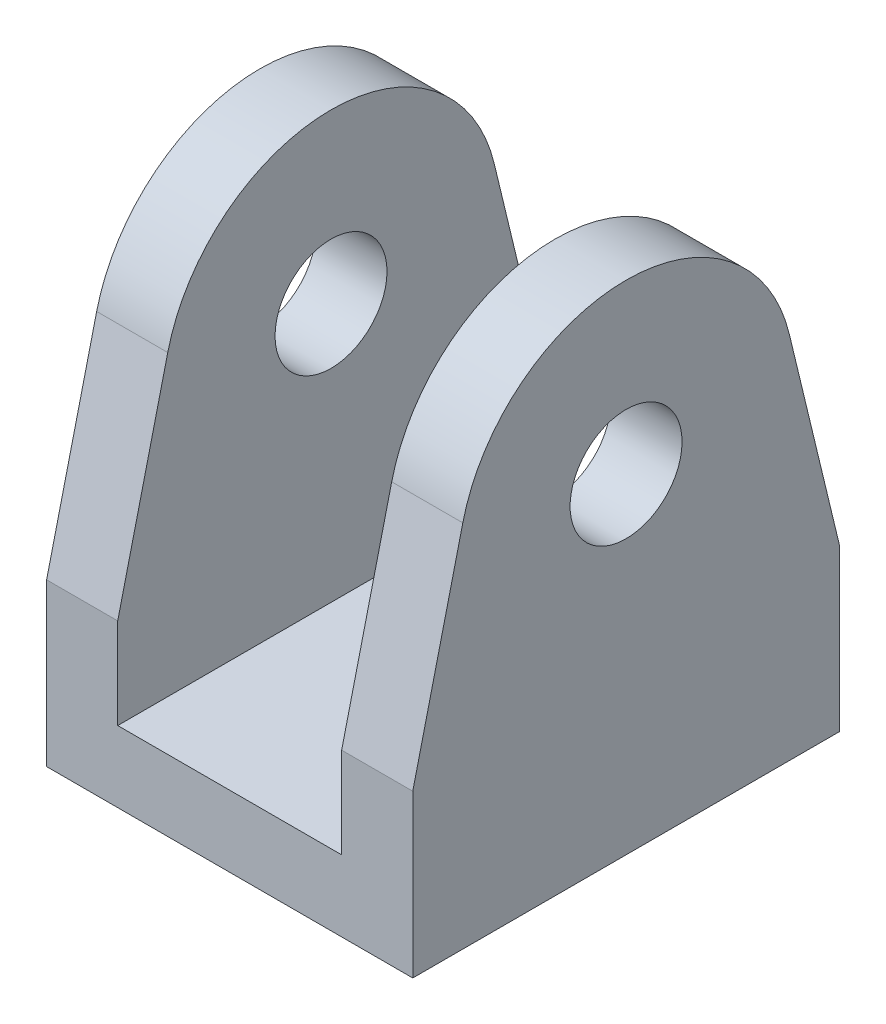
ISO-10303-21;
HEADER;
FILE_DESCRIPTION(('STEP AP214'),'2;1');
FILE_NAME('part.step','',(''),(''),'','','');
FILE_SCHEMA(('AUTOMOTIVE_DESIGN { 1 0 10303 214 1 1 1 1 }'));
ENDSEC;
DATA;
#1=APPLICATION_CONTEXT('core data for automotive mechanical design processes');
#2=APPLICATION_PROTOCOL_DEFINITION('international standard','automotive_design',2000,#1);
#3=PRODUCT_CONTEXT('',#1,'mechanical');
#4=PRODUCT('Part','Part','',(#3));
#5=PRODUCT_RELATED_PRODUCT_CATEGORY('part','',(#4));
#6=PRODUCT_DEFINITION_FORMATION('','',#4);
#7=PRODUCT_DEFINITION_CONTEXT('part definition',#1,'design');
#8=PRODUCT_DEFINITION('design','',#6,#7);
#9=PRODUCT_DEFINITION_SHAPE('','',#8);
#10=(LENGTH_UNIT() NAMED_UNIT(*) SI_UNIT(.MILLI.,.METRE.));
#11=(NAMED_UNIT(*) PLANE_ANGLE_UNIT() SI_UNIT($,.RADIAN.));
#12=(NAMED_UNIT(*) SI_UNIT($,.STERADIAN.) SOLID_ANGLE_UNIT());
#13=UNCERTAINTY_MEASURE_WITH_UNIT(LENGTH_MEASURE(1.E-05),#10,'distance_accuracy_value','');
#14=(GEOMETRIC_REPRESENTATION_CONTEXT(3) GLOBAL_UNCERTAINTY_ASSIGNED_CONTEXT((#13)) GLOBAL_UNIT_ASSIGNED_CONTEXT((#10,
#11,#12)) REPRESENTATION_CONTEXT('',''));
#15=CARTESIAN_POINT('',(0.,0.,0.));
#16=DIRECTION('',(0.,0.,1.));
#17=DIRECTION('',(1.,0.,0.));
#18=AXIS2_PLACEMENT_3D('',#15,#16,#17);
#19=CARTESIAN_POINT('',(-8.175,3.175,0.));
#20=DIRECTION('',(-1.,0.,0.));
#21=DIRECTION('',(0.,0.,1.));
#22=AXIS2_PLACEMENT_3D('',#19,#20,#21);
#23=PLANE('',#22);
#24=CARTESIAN_POINT('',(-8.175,14.725,0.));
#25=DIRECTION('',(1.,0.,0.));
#26=DIRECTION('',(0.,0.,-1.));
#27=AXIS2_PLACEMENT_3D('',#24,#25,#26);
#28=CIRCLE('',#27,2.5);
#29=CARTESIAN_POINT('',(-8.175,14.725,-2.5));
#30=VERTEX_POINT('',#29);
#31=EDGE_CURVE('E367',#30,#30,#28,.T.);
#32=ORIENTED_EDGE('',*,*,#31,.T.);
#33=EDGE_LOOP('',(#32));
#34=FACE_BOUND('',#33,.T.);
#35=CARTESIAN_POINT('',(-8.175,14.725,0.));
#36=DIRECTION('',(1.,0.,0.));
#37=DIRECTION('',(0.,0.,-1.));
#38=AXIS2_PLACEMENT_3D('',#35,#36,#37);
#39=CIRCLE('',#38,7.5);
#40=CARTESIAN_POINT('',(-8.175,16.4842521719163,-7.29074974166635));
#41=VERTEX_POINT('',#40);
#42=CARTESIAN_POINT('',(-8.175,16.4842521719163,7.29074974166635));
#43=VERTEX_POINT('',#42);
#44=EDGE_CURVE('E128',#41,#43,#39,.T.);
#45=ORIENTED_EDGE('',*,*,#44,.F.);
#46=DIRECTION('',(0.,0.972099965555513,0.234566956255502));
#47=VECTOR('',#46,1.);
#48=CARTESIAN_POINT('',(-8.175,2.5694460707549,-10.6483814973363));
#49=LINE('',#48,#47);
#50=CARTESIAN_POINT('',(-8.175,7.22499999999999,-9.525));
#51=VERTEX_POINT('',#50);
#52=EDGE_CURVE('E130',#51,#41,#49,.T.);
#53=ORIENTED_EDGE('',*,*,#52,.F.);
#54=DIRECTION('',(0.,-1.,0.));
#55=VECTOR('',#54,1.);
#56=CARTESIAN_POINT('',(-8.175,3.175,-9.525));
#57=LINE('',#56,#55);
#58=CARTESIAN_POINT('',(-8.175,0.,-9.525));
#59=VERTEX_POINT('',#58);
#60=EDGE_CURVE('E214',#51,#59,#57,.T.);
#61=ORIENTED_EDGE('',*,*,#60,.T.);
#62=DIRECTION('',(0.,0.,-1.));
#63=VECTOR('',#62,1.);
#64=CARTESIAN_POINT('',(-8.175,0.,0.));
#65=LINE('',#64,#63);
#66=CARTESIAN_POINT('',(-8.175,0.,9.525));
#67=VERTEX_POINT('',#66);
#68=EDGE_CURVE('E202',#67,#59,#65,.T.);
#69=ORIENTED_EDGE('',*,*,#68,.F.);
#70=DIRECTION('',(0.,-1.,0.));
#71=VECTOR('',#70,1.);
#72=CARTESIAN_POINT('',(-8.175,3.175,9.525));
#73=LINE('',#72,#71);
#74=CARTESIAN_POINT('',(-8.175,7.22499999999999,9.525));
#75=VERTEX_POINT('',#74);
#76=EDGE_CURVE('E212',#75,#67,#73,.T.);
#77=ORIENTED_EDGE('',*,*,#76,.F.);
#78=DIRECTION('',(0.,0.972099965555513,-0.234566956255502));
#79=VECTOR('',#78,1.);
#80=CARTESIAN_POINT('',(-8.175,2.5694460707549,10.6483814973363));
#81=LINE('',#80,#79);
#82=EDGE_CURVE('E133',#75,#43,#81,.T.);
#83=ORIENTED_EDGE('',*,*,#82,.T.);
#84=EDGE_LOOP('',(#45,#53,#61,#69,#77,#83));
#85=FACE_BOUND('',#84,.T.);
#86=ADVANCED_FACE('F36',(#34,#85),#23,.T.);
#87=CARTESIAN_POINT('',(8.175,3.175,0.));
#88=DIRECTION('',(-1.,0.,0.));
#89=DIRECTION('',(0.,0.,1.));
#90=AXIS2_PLACEMENT_3D('',#87,#88,#89);
#91=PLANE('',#90);
#92=CARTESIAN_POINT('',(8.175,14.725,0.));
#93=DIRECTION('',(1.,0.,0.));
#94=DIRECTION('',(0.,0.,-1.));
#95=AXIS2_PLACEMENT_3D('',#92,#93,#94);
#96=CIRCLE('',#95,2.5);
#97=CARTESIAN_POINT('',(8.175,14.725,-2.5));
#98=VERTEX_POINT('',#97);
#99=EDGE_CURVE('E377',#98,#98,#96,.T.);
#100=ORIENTED_EDGE('',*,*,#99,.F.);
#101=EDGE_LOOP('',(#100));
#102=FACE_BOUND('',#101,.T.);
#103=DIRECTION('',(0.,0.972099965555513,0.234566956255502));
#104=VECTOR('',#103,1.);
#105=CARTESIAN_POINT('',(8.175,2.5694460707549,-10.6483814973363));
#106=LINE('',#105,#104);
#107=CARTESIAN_POINT('',(8.175,7.22499999999999,-9.525));
#108=VERTEX_POINT('',#107);
#109=CARTESIAN_POINT('',(8.175,16.4842521719163,-7.29074974166635));
#110=VERTEX_POINT('',#109);
#111=EDGE_CURVE('E148',#108,#110,#106,.T.);
#112=ORIENTED_EDGE('',*,*,#111,.T.);
#113=CARTESIAN_POINT('',(8.175,14.725,0.));
#114=DIRECTION('',(1.,0.,0.));
#115=DIRECTION('',(0.,0.,-1.));
#116=AXIS2_PLACEMENT_3D('',#113,#114,#115);
#117=CIRCLE('',#116,7.5);
#118=CARTESIAN_POINT('',(8.175,16.4842521719163,7.29074974166635));
#119=VERTEX_POINT('',#118);
#120=EDGE_CURVE('E162',#110,#119,#117,.T.);
#121=ORIENTED_EDGE('',*,*,#120,.T.);
#122=DIRECTION('',(0.,0.972099965555513,-0.234566956255502));
#123=VECTOR('',#122,1.);
#124=CARTESIAN_POINT('',(8.175,2.5694460707549,10.6483814973363));
#125=LINE('',#124,#123);
#126=CARTESIAN_POINT('',(8.175,7.22499999999999,9.525));
#127=VERTEX_POINT('',#126);
#128=EDGE_CURVE('E138',#127,#119,#125,.T.);
#129=ORIENTED_EDGE('',*,*,#128,.F.);
#130=DIRECTION('',(0.,-1.,0.));
#131=VECTOR('',#130,1.);
#132=CARTESIAN_POINT('',(8.175,3.175,9.525));
#133=LINE('',#132,#131);
#134=CARTESIAN_POINT('',(8.175,0.,9.525));
#135=VERTEX_POINT('',#134);
#136=EDGE_CURVE('E210',#127,#135,#133,.T.);
#137=ORIENTED_EDGE('',*,*,#136,.T.);
#138=DIRECTION('',(0.,0.,-1.));
#139=VECTOR('',#138,1.);
#140=CARTESIAN_POINT('',(8.175,0.,0.));
#141=LINE('',#140,#139);
#142=CARTESIAN_POINT('',(8.175,0.,-9.525));
#143=VERTEX_POINT('',#142);
#144=EDGE_CURVE('E197',#135,#143,#141,.T.);
#145=ORIENTED_EDGE('',*,*,#144,.T.);
#146=DIRECTION('',(0.,-1.,0.));
#147=VECTOR('',#146,1.);
#148=CARTESIAN_POINT('',(8.175,3.175,-9.525));
#149=LINE('',#148,#147);
#150=EDGE_CURVE('E58',#108,#143,#149,.T.);
#151=ORIENTED_EDGE('',*,*,#150,.F.);
#152=EDGE_LOOP('',(#112,#121,#129,#137,#145,#151));
#153=FACE_BOUND('',#152,.T.);
#154=ADVANCED_FACE('F242',(#102,#153),#91,.F.);
#155=CARTESIAN_POINT('',(-5.,22.225,0.));
#156=DIRECTION('',(-1.,0.,0.));
#157=DIRECTION('',(0.,0.,1.));
#158=AXIS2_PLACEMENT_3D('',#155,#156,#157);
#159=PLANE('',#158);
#160=CARTESIAN_POINT('',(-5.,14.725,0.));
#161=DIRECTION('',(-1.,0.,0.));
#162=DIRECTION('',(0.,0.,1.));
#163=AXIS2_PLACEMENT_3D('',#160,#161,#162);
#164=CIRCLE('',#163,2.5);
#165=CARTESIAN_POINT('',(-5.,14.725,2.5));
#166=VERTEX_POINT('',#165);
#167=EDGE_CURVE('E370',#166,#166,#164,.T.);
#168=ORIENTED_EDGE('',*,*,#167,.T.);
#169=EDGE_LOOP('',(#168));
#170=FACE_BOUND('',#169,.T.);
#171=DIRECTION('',(0.,-0.972099965555513,-0.234566956255502));
#172=VECTOR('',#171,1.);
#173=CARTESIAN_POINT('',(-5.,23.571589744664,-5.58058076594309));
#174=LINE('',#173,#172);
#175=CARTESIAN_POINT('',(-5.,16.4842521719163,-7.29074974166635));
#176=VERTEX_POINT('',#175);
#177=CARTESIAN_POINT('',(-5.,7.22499999999999,-9.525));
#178=VERTEX_POINT('',#177);
#179=EDGE_CURVE('E161',#176,#178,#174,.T.);
#180=ORIENTED_EDGE('',*,*,#179,.F.);
#181=CARTESIAN_POINT('',(-5.,14.725,0.));
#182=DIRECTION('',(-1.,0.,0.));
#183=DIRECTION('',(0.,0.,1.));
#184=AXIS2_PLACEMENT_3D('',#181,#182,#183);
#185=CIRCLE('',#184,7.5);
#186=CARTESIAN_POINT('',(-5.,16.4842521719163,7.29074974166635));
#187=VERTEX_POINT('',#186);
#188=EDGE_CURVE('E152',#187,#176,#185,.T.);
#189=ORIENTED_EDGE('',*,*,#188,.F.);
#190=DIRECTION('',(0.,-0.972099965555513,0.234566956255502));
#191=VECTOR('',#190,1.);
#192=CARTESIAN_POINT('',(-5.,23.571589744664,5.58058076594309));
#193=LINE('',#192,#191);
#194=CARTESIAN_POINT('',(-5.,7.22499999999999,9.525));
#195=VERTEX_POINT('',#194);
#196=EDGE_CURVE('E178',#187,#195,#193,.T.);
#197=ORIENTED_EDGE('',*,*,#196,.T.);
#198=DIRECTION('',(0.,-1.,0.));
#199=VECTOR('',#198,1.);
#200=CARTESIAN_POINT('',(-5.,22.225,9.525));
#201=LINE('',#200,#199);
#202=CARTESIAN_POINT('',(-5.,3.175,9.525));
#203=VERTEX_POINT('',#202);
#204=EDGE_CURVE('E51',#195,#203,#201,.T.);
#205=ORIENTED_EDGE('',*,*,#204,.T.);
#206=DIRECTION('',(0.,0.,-1.));
#207=VECTOR('',#206,1.);
#208=CARTESIAN_POINT('',(-5.,3.175,0.));
#209=LINE('',#208,#207);
#210=CARTESIAN_POINT('',(-5.,3.175,-9.525));
#211=VERTEX_POINT('',#210);
#212=EDGE_CURVE('E186',#203,#211,#209,.T.);
#213=ORIENTED_EDGE('',*,*,#212,.T.);
#214=DIRECTION('',(0.,-1.,0.));
#215=VECTOR('',#214,1.);
#216=CARTESIAN_POINT('',(-5.,22.225,-9.525));
#217=LINE('',#216,#215);
#218=EDGE_CURVE('E189',#178,#211,#217,.T.);
#219=ORIENTED_EDGE('',*,*,#218,.F.);
#220=EDGE_LOOP('',(#180,#189,#197,#205,#213,#219));
#221=FACE_BOUND('',#220,.T.);
#222=ADVANCED_FACE('F250',(#170,#221),#159,.F.);
#223=CARTESIAN_POINT('',(5.,22.225,0.));
#224=DIRECTION('',(-1.,0.,0.));
#225=DIRECTION('',(0.,0.,1.));
#226=AXIS2_PLACEMENT_3D('',#223,#224,#225);
#227=PLANE('',#226);
#228=CARTESIAN_POINT('',(5.,14.725,0.));
#229=DIRECTION('',(-1.,0.,0.));
#230=DIRECTION('',(0.,0.,1.));
#231=AXIS2_PLACEMENT_3D('',#228,#229,#230);
#232=CIRCLE('',#231,2.5);
#233=CARTESIAN_POINT('',(5.,14.725,2.5));
#234=VERTEX_POINT('',#233);
#235=EDGE_CURVE('E371',#234,#234,#232,.T.);
#236=ORIENTED_EDGE('',*,*,#235,.F.);
#237=EDGE_LOOP('',(#236));
#238=FACE_BOUND('',#237,.T.);
#239=CARTESIAN_POINT('',(5.,14.725,0.));
#240=DIRECTION('',(-1.,0.,0.));
#241=DIRECTION('',(0.,0.,1.));
#242=AXIS2_PLACEMENT_3D('',#239,#240,#241);
#243=CIRCLE('',#242,7.5);
#244=CARTESIAN_POINT('',(5.,16.4842521719163,7.29074974166635));
#245=VERTEX_POINT('',#244);
#246=CARTESIAN_POINT('',(5.,16.4842521719163,-7.29074974166635));
#247=VERTEX_POINT('',#246);
#248=EDGE_CURVE('E172',#245,#247,#243,.T.);
#249=ORIENTED_EDGE('',*,*,#248,.T.);
#250=DIRECTION('',(0.,-0.972099965555513,-0.234566956255502));
#251=VECTOR('',#250,1.);
#252=CARTESIAN_POINT('',(5.,23.571589744664,-5.58058076594309));
#253=LINE('',#252,#251);
#254=CARTESIAN_POINT('',(5.,7.22499999999999,-9.525));
#255=VERTEX_POINT('',#254);
#256=EDGE_CURVE('E154',#247,#255,#253,.T.);
#257=ORIENTED_EDGE('',*,*,#256,.T.);
#258=DIRECTION('',(0.,-1.,0.));
#259=VECTOR('',#258,1.);
#260=CARTESIAN_POINT('',(5.,22.225,-9.525));
#261=LINE('',#260,#259);
#262=CARTESIAN_POINT('',(5.,3.175,-9.525));
#263=VERTEX_POINT('',#262);
#264=EDGE_CURVE('E183',#255,#263,#261,.T.);
#265=ORIENTED_EDGE('',*,*,#264,.T.);
#266=DIRECTION('',(0.,0.,-1.));
#267=VECTOR('',#266,1.);
#268=CARTESIAN_POINT('',(5.,3.175,0.));
#269=LINE('',#268,#267);
#270=CARTESIAN_POINT('',(5.,3.175,9.525));
#271=VERTEX_POINT('',#270);
#272=EDGE_CURVE('E180',#271,#263,#269,.T.);
#273=ORIENTED_EDGE('',*,*,#272,.F.);
#274=DIRECTION('',(0.,-1.,0.));
#275=VECTOR('',#274,1.);
#276=CARTESIAN_POINT('',(5.,22.225,9.525));
#277=LINE('',#276,#275);
#278=CARTESIAN_POINT('',(5.,7.22499999999999,9.525));
#279=VERTEX_POINT('',#278);
#280=EDGE_CURVE('E184',#279,#271,#277,.T.);
#281=ORIENTED_EDGE('',*,*,#280,.F.);
#282=DIRECTION('',(0.,-0.972099965555513,0.234566956255502));
#283=VECTOR('',#282,1.);
#284=CARTESIAN_POINT('',(5.,23.571589744664,5.58058076594309));
#285=LINE('',#284,#283);
#286=EDGE_CURVE('E44',#245,#279,#285,.T.);
#287=ORIENTED_EDGE('',*,*,#286,.F.);
#288=EDGE_LOOP('',(#249,#257,#265,#273,#281,#287));
#289=FACE_BOUND('',#288,.T.);
#290=ADVANCED_FACE('F228',(#238,#289),#227,.T.);
#291=CARTESIAN_POINT('',(0.,3.175,-9.525));
#292=DIRECTION('',(0.,0.,-1.));
#293=DIRECTION('',(-1.,0.,0.));
#294=AXIS2_PLACEMENT_3D('',#291,#292,#293);
#295=PLANE('',#294);
#296=ORIENTED_EDGE('',*,*,#60,.F.);
#297=DIRECTION('',(1.,0.,0.));
#298=VECTOR('',#297,1.);
#299=CARTESIAN_POINT('',(-8.175,7.22499999999999,-9.525));
#300=LINE('',#299,#298);
#301=EDGE_CURVE('E146',#51,#178,#300,.T.);
#302=ORIENTED_EDGE('',*,*,#301,.T.);
#303=ORIENTED_EDGE('',*,*,#218,.T.);
#304=DIRECTION('',(1.,0.,0.));
#305=VECTOR('',#304,1.);
#306=CARTESIAN_POINT('',(0.,3.175,-9.525));
#307=LINE('',#306,#305);
#308=EDGE_CURVE('E193',#211,#263,#307,.T.);
#309=ORIENTED_EDGE('',*,*,#308,.T.);
#310=ORIENTED_EDGE('',*,*,#264,.F.);
#311=DIRECTION('',(1.,0.,0.));
#312=VECTOR('',#311,1.);
#313=CARTESIAN_POINT('',(0.,7.225,-9.525));
#314=LINE('',#313,#312);
#315=EDGE_CURVE('E11',#255,#108,#314,.T.);
#316=ORIENTED_EDGE('',*,*,#315,.T.);
#317=ORIENTED_EDGE('',*,*,#150,.T.);
#318=DIRECTION('',(1.,0.,0.));
#319=VECTOR('',#318,1.);
#320=CARTESIAN_POINT('',(0.,0.,-9.525));
#321=LINE('',#320,#319);
#322=EDGE_CURVE('E191',#59,#143,#321,.T.);
#323=ORIENTED_EDGE('',*,*,#322,.F.);
#324=EDGE_LOOP('',(#296,#302,#303,#309,#310,#316,#317,#323));
#325=FACE_BOUND('',#324,.T.);
#326=ADVANCED_FACE('F38',(#325),#295,.T.);
#327=CARTESIAN_POINT('',(0.,3.175,9.525));
#328=DIRECTION('',(0.,0.,-1.));
#329=DIRECTION('',(-1.,0.,0.));
#330=AXIS2_PLACEMENT_3D('',#327,#328,#329);
#331=PLANE('',#330);
#332=ORIENTED_EDGE('',*,*,#136,.F.);
#333=DIRECTION('',(1.,0.,0.));
#334=VECTOR('',#333,1.);
#335=CARTESIAN_POINT('',(-8.175,7.22499999999999,9.525));
#336=LINE('',#335,#334);
#337=EDGE_CURVE('E165',#279,#127,#336,.T.);
#338=ORIENTED_EDGE('',*,*,#337,.F.);
#339=ORIENTED_EDGE('',*,*,#280,.T.);
#340=DIRECTION('',(1.,0.,0.));
#341=VECTOR('',#340,1.);
#342=CARTESIAN_POINT('',(0.,3.175,9.525));
#343=LINE('',#342,#341);
#344=EDGE_CURVE('E196',#203,#271,#343,.T.);
#345=ORIENTED_EDGE('',*,*,#344,.F.);
#346=ORIENTED_EDGE('',*,*,#204,.F.);
#347=EDGE_CURVE('E174',#75,#195,#336,.T.);
#348=ORIENTED_EDGE('',*,*,#347,.F.);
#349=ORIENTED_EDGE('',*,*,#76,.T.);
#350=DIRECTION('',(1.,0.,0.));
#351=VECTOR('',#350,1.);
#352=CARTESIAN_POINT('',(0.,0.,9.525));
#353=LINE('',#352,#351);
#354=EDGE_CURVE('E205',#67,#135,#353,.T.);
#355=ORIENTED_EDGE('',*,*,#354,.T.);
#356=EDGE_LOOP('',(#332,#338,#339,#345,#346,#348,#349,#355));
#357=FACE_BOUND('',#356,.T.);
#358=ADVANCED_FACE('F225',(#357),#331,.F.);
#359=CARTESIAN_POINT('',(0.,3.175,0.));
#360=DIRECTION('',(0.,1.,0.));
#361=DIRECTION('',(0.,0.,1.));
#362=AXIS2_PLACEMENT_3D('',#359,#360,#361);
#363=PLANE('',#362);
#364=ORIENTED_EDGE('',*,*,#272,.T.);
#365=ORIENTED_EDGE('',*,*,#308,.F.);
#366=ORIENTED_EDGE('',*,*,#212,.F.);
#367=ORIENTED_EDGE('',*,*,#344,.T.);
#368=EDGE_LOOP('',(#364,#365,#366,#367));
#369=FACE_BOUND('',#368,.T.);
#370=ADVANCED_FACE('F232',(#369),#363,.T.);
#371=CARTESIAN_POINT('',(0.,0.,0.));
#372=DIRECTION('',(0.,1.,0.));
#373=DIRECTION('',(0.,0.,1.));
#374=AXIS2_PLACEMENT_3D('',#371,#372,#373);
#375=PLANE('',#374);
#376=ORIENTED_EDGE('',*,*,#322,.T.);
#377=ORIENTED_EDGE('',*,*,#144,.F.);
#378=ORIENTED_EDGE('',*,*,#354,.F.);
#379=ORIENTED_EDGE('',*,*,#68,.T.);
#380=EDGE_LOOP('',(#376,#377,#378,#379));
#381=FACE_BOUND('',#380,.T.);
#382=ADVANCED_FACE('F238',(#381),#375,.F.);
#383=CARTESIAN_POINT('',(-8.175,14.725,0.));
#384=DIRECTION('',(1.,0.,0.));
#385=DIRECTION('',(0.,0.,-1.));
#386=AXIS2_PLACEMENT_3D('',#383,#384,#385);
#387=CYLINDRICAL_SURFACE('',#386,7.5);
#388=DIRECTION('',(1.,0.,0.));
#389=VECTOR('',#388,1.);
#390=CARTESIAN_POINT('',(-8.175,16.4842521719163,7.29074974166635));
#391=LINE('',#390,#389);
#392=EDGE_CURVE('E173',#245,#119,#391,.T.);
#393=ORIENTED_EDGE('',*,*,#392,.T.);
#394=ORIENTED_EDGE('',*,*,#120,.F.);
#395=DIRECTION('',(1.,0.,0.));
#396=VECTOR('',#395,1.);
#397=CARTESIAN_POINT('',(-8.175,16.4842521719163,-7.29074974166635));
#398=LINE('',#397,#396);
#399=EDGE_CURVE('E147',#247,#110,#398,.T.);
#400=ORIENTED_EDGE('',*,*,#399,.F.);
#401=ORIENTED_EDGE('',*,*,#248,.F.);
#402=EDGE_LOOP('',(#393,#394,#400,#401));
#403=FACE_BOUND('',#402,.T.);
#404=ADVANCED_FACE('F245',(#403),#387,.T.);
#405=CARTESIAN_POINT('',(-8.175,2.5694460707549,10.6483814973363));
#406=DIRECTION('',(0.,-0.234566956255502,-0.972099965555513));
#407=DIRECTION('',(0.,0.972099965555513,-0.234566956255502));
#408=AXIS2_PLACEMENT_3D('',#405,#406,#407);
#409=PLANE('',#408);
#410=ORIENTED_EDGE('',*,*,#286,.T.);
#411=ORIENTED_EDGE('',*,*,#337,.T.);
#412=ORIENTED_EDGE('',*,*,#128,.T.);
#413=ORIENTED_EDGE('',*,*,#392,.F.);
#414=EDGE_LOOP('',(#410,#411,#412,#413));
#415=FACE_BOUND('',#414,.T.);
#416=ADVANCED_FACE('F219',(#415),#409,.F.);
#417=EDGE_CURVE('E170',#43,#187,#391,.T.);
#418=ORIENTED_EDGE('',*,*,#417,.F.);
#419=ORIENTED_EDGE('',*,*,#82,.F.);
#420=ORIENTED_EDGE('',*,*,#347,.T.);
#421=ORIENTED_EDGE('',*,*,#196,.F.);
#422=EDGE_LOOP('',(#418,#419,#420,#421));
#423=FACE_BOUND('',#422,.T.);
#424=ADVANCED_FACE('F251',(#423),#409,.F.);
#425=ORIENTED_EDGE('',*,*,#188,.T.);
#426=EDGE_CURVE('E143',#41,#176,#398,.T.);
#427=ORIENTED_EDGE('',*,*,#426,.F.);
#428=ORIENTED_EDGE('',*,*,#44,.T.);
#429=ORIENTED_EDGE('',*,*,#417,.T.);
#430=EDGE_LOOP('',(#425,#427,#428,#429));
#431=FACE_BOUND('',#430,.T.);
#432=ADVANCED_FACE('F150',(#431),#387,.T.);
#433=CARTESIAN_POINT('',(-8.175,2.5694460707549,-10.6483814973363));
#434=DIRECTION('',(0.,0.234566956255502,-0.972099965555513));
#435=DIRECTION('',(0.,0.972099965555513,0.234566956255502));
#436=AXIS2_PLACEMENT_3D('',#433,#434,#435);
#437=PLANE('',#436);
#438=ORIENTED_EDGE('',*,*,#179,.T.);
#439=ORIENTED_EDGE('',*,*,#301,.F.);
#440=ORIENTED_EDGE('',*,*,#52,.T.);
#441=ORIENTED_EDGE('',*,*,#426,.T.);
#442=EDGE_LOOP('',(#438,#439,#440,#441));
#443=FACE_BOUND('',#442,.T.);
#444=ADVANCED_FACE('F142',(#443),#437,.T.);
#445=ORIENTED_EDGE('',*,*,#399,.T.);
#446=ORIENTED_EDGE('',*,*,#111,.F.);
#447=ORIENTED_EDGE('',*,*,#315,.F.);
#448=ORIENTED_EDGE('',*,*,#256,.F.);
#449=EDGE_LOOP('',(#445,#446,#447,#448));
#450=FACE_BOUND('',#449,.T.);
#451=ADVANCED_FACE('F248',(#450),#437,.T.);
#452=CARTESIAN_POINT('',(8.175,14.725,0.));
#453=DIRECTION('',(1.,0.,0.));
#454=DIRECTION('',(0.,0.,-1.));
#455=AXIS2_PLACEMENT_3D('',#452,#453,#454);
#456=CYLINDRICAL_SURFACE('',#455,2.5);
#457=ORIENTED_EDGE('',*,*,#235,.T.);
#458=EDGE_LOOP('',(#457));
#459=FACE_BOUND('',#458,.T.);
#460=ORIENTED_EDGE('',*,*,#99,.T.);
#461=EDGE_LOOP('',(#460));
#462=FACE_BOUND('',#461,.T.);
#463=ADVANCED_FACE('F316',(#459,#462),#456,.F.);
#464=ORIENTED_EDGE('',*,*,#31,.F.);
#465=EDGE_LOOP('',(#464));
#466=FACE_BOUND('',#465,.T.);
#467=ORIENTED_EDGE('',*,*,#167,.F.);
#468=EDGE_LOOP('',(#467));
#469=FACE_BOUND('',#468,.T.);
#470=ADVANCED_FACE('F352',(#466,#469),#456,.F.);
#471=CLOSED_SHELL('',(#86,#154,#222,#290,#326,#358,#370,#382,#404,#416,#424,#432,#444,#451,#463,#470));
#472=MANIFOLD_SOLID_BREP('B2',#471);
#473=ADVANCED_BREP_SHAPE_REPRESENTATION('',(#18,#472),#14);
#474=SHAPE_DEFINITION_REPRESENTATION(#9,#473);
ENDSEC;
END-ISO-10303-21;
